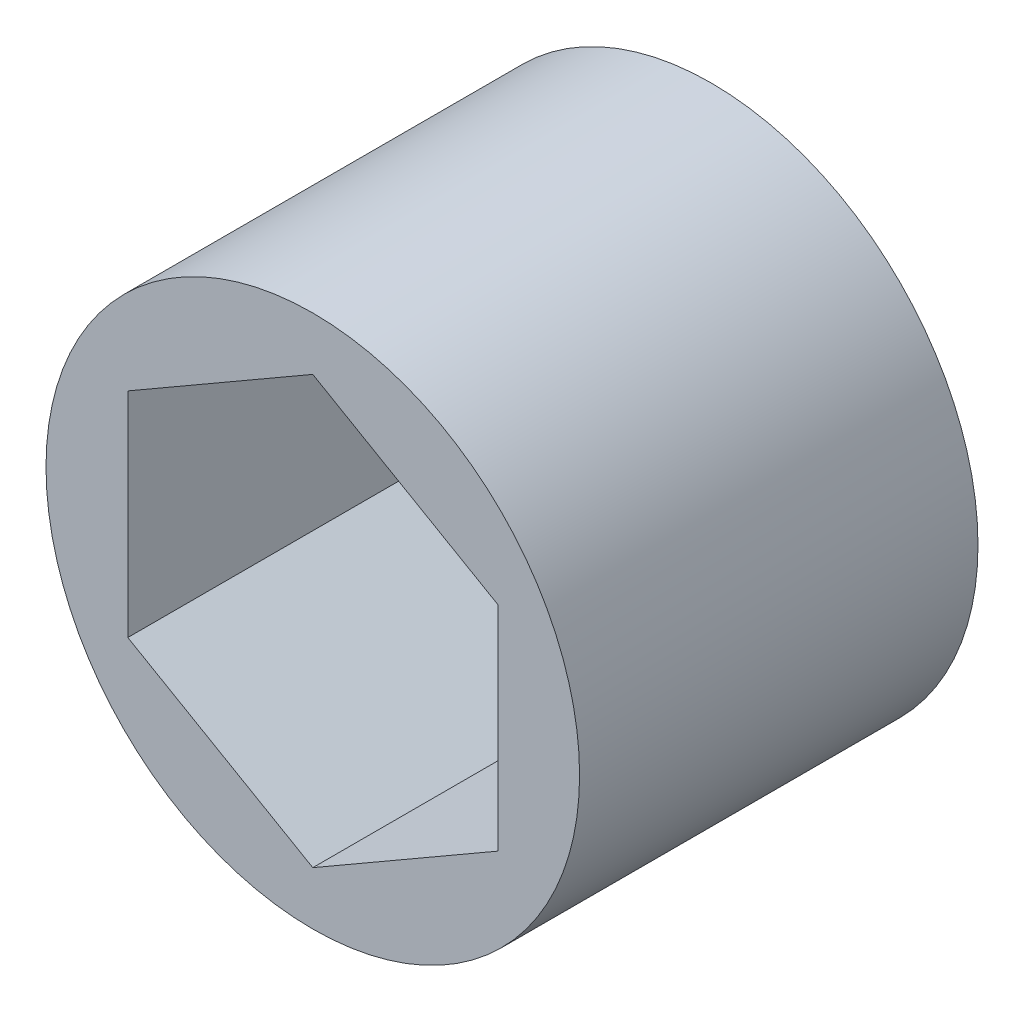
ISO-10303-21;
HEADER;
FILE_DESCRIPTION(('STEP AP214'),'2;1');
FILE_NAME('part.step','',(''),(''),'','','');
FILE_SCHEMA(('AUTOMOTIVE_DESIGN { 1 0 10303 214 1 1 1 1 }'));
ENDSEC;
DATA;
#1=APPLICATION_CONTEXT('core data for automotive mechanical design processes');
#2=APPLICATION_PROTOCOL_DEFINITION('international standard','automotive_design',2000,#1);
#3=PRODUCT_CONTEXT('',#1,'mechanical');
#4=PRODUCT('Part','Part','',(#3));
#5=PRODUCT_RELATED_PRODUCT_CATEGORY('part','',(#4));
#6=PRODUCT_DEFINITION_FORMATION('','',#4);
#7=PRODUCT_DEFINITION_CONTEXT('part definition',#1,'design');
#8=PRODUCT_DEFINITION('design','',#6,#7);
#9=PRODUCT_DEFINITION_SHAPE('','',#8);
#10=(LENGTH_UNIT() NAMED_UNIT(*) SI_UNIT(.MILLI.,.METRE.));
#11=(NAMED_UNIT(*) PLANE_ANGLE_UNIT() SI_UNIT($,.RADIAN.));
#12=(NAMED_UNIT(*) SI_UNIT($,.STERADIAN.) SOLID_ANGLE_UNIT());
#13=UNCERTAINTY_MEASURE_WITH_UNIT(LENGTH_MEASURE(1.E-05),#10,'distance_accuracy_value','');
#14=(GEOMETRIC_REPRESENTATION_CONTEXT(3) GLOBAL_UNCERTAINTY_ASSIGNED_CONTEXT((#13)) GLOBAL_UNIT_ASSIGNED_CONTEXT((#10,
#11,#12)) REPRESENTATION_CONTEXT('',''));
#15=CARTESIAN_POINT('',(0.,0.,0.));
#16=DIRECTION('',(0.,0.,1.));
#17=DIRECTION('',(1.,0.,0.));
#18=AXIS2_PLACEMENT_3D('',#15,#16,#17);
#19=CARTESIAN_POINT('',(0.,0.,7.112));
#20=DIRECTION('',(0.,0.,1.));
#21=DIRECTION('',(1.,0.,0.));
#22=AXIS2_PLACEMENT_3D('',#19,#20,#21);
#23=PLANE('',#22);
#24=CARTESIAN_POINT('',(0.,0.,7.112));
#25=DIRECTION('',(0.,0.,1.));
#26=DIRECTION('',(1.,0.,0.));
#27=AXIS2_PLACEMENT_3D('',#24,#25,#26);
#28=CIRCLE('',#27,9.525);
#29=CARTESIAN_POINT('',(9.525,0.,7.112));
#30=VERTEX_POINT('',#29);
#31=EDGE_CURVE('E11',#30,#30,#28,.T.);
#32=ORIENTED_EDGE('',*,*,#31,.T.);
#33=EDGE_LOOP('',(#32));
#34=FACE_BOUND('',#33,.T.);
#35=DIRECTION('',(-0.866025403784439,-0.5,0.));
#36=VECTOR('',#35,1.);
#37=CARTESIAN_POINT('',(0.,7.62564235545658,7.112));
#38=LINE('',#37,#36);
#39=CARTESIAN_POINT('',(0.,7.62564235545658,7.112));
#40=VERTEX_POINT('',#39);
#41=CARTESIAN_POINT('',(-6.604,3.81282117772829,7.112));
#42=VERTEX_POINT('',#41);
#43=EDGE_CURVE('E108',#40,#42,#38,.T.);
#44=ORIENTED_EDGE('',*,*,#43,.F.);
#45=DIRECTION('',(-0.866025403784439,0.5,0.));
#46=VECTOR('',#45,1.);
#47=CARTESIAN_POINT('',(6.604,3.81282117772829,7.112));
#48=LINE('',#47,#46);
#49=CARTESIAN_POINT('',(6.604,3.81282117772829,7.112));
#50=VERTEX_POINT('',#49);
#51=EDGE_CURVE('E99',#50,#40,#48,.T.);
#52=ORIENTED_EDGE('',*,*,#51,.F.);
#53=DIRECTION('',(0.,1.,0.));
#54=VECTOR('',#53,1.);
#55=CARTESIAN_POINT('',(6.604,-3.81282117772829,7.112));
#56=LINE('',#55,#54);
#57=CARTESIAN_POINT('',(6.604,-3.81282117772829,7.112));
#58=VERTEX_POINT('',#57);
#59=EDGE_CURVE('E133',#58,#50,#56,.T.);
#60=ORIENTED_EDGE('',*,*,#59,.F.);
#61=DIRECTION('',(0.866025403784439,0.5,0.));
#62=VECTOR('',#61,1.);
#63=CARTESIAN_POINT('',(0.,-7.62564235545658,7.112));
#64=LINE('',#63,#62);
#65=CARTESIAN_POINT('',(0.,-7.62564235545658,7.112));
#66=VERTEX_POINT('',#65);
#67=EDGE_CURVE('E130',#66,#58,#64,.T.);
#68=ORIENTED_EDGE('',*,*,#67,.F.);
#69=DIRECTION('',(0.866025403784439,-0.5,0.));
#70=VECTOR('',#69,1.);
#71=CARTESIAN_POINT('',(-6.604,-3.81282117772829,7.112));
#72=LINE('',#71,#70);
#73=CARTESIAN_POINT('',(-6.604,-3.81282117772829,7.112));
#74=VERTEX_POINT('',#73);
#75=EDGE_CURVE('E125',#74,#66,#72,.T.);
#76=ORIENTED_EDGE('',*,*,#75,.F.);
#77=DIRECTION('',(0.,-1.,0.));
#78=VECTOR('',#77,1.);
#79=CARTESIAN_POINT('',(-6.604,3.81282117772829,7.112));
#80=LINE('',#79,#78);
#81=EDGE_CURVE('E121',#42,#74,#80,.T.);
#82=ORIENTED_EDGE('',*,*,#81,.F.);
#83=EDGE_LOOP('',(#44,#52,#60,#68,#76,#82));
#84=FACE_BOUND('',#83,.T.);
#85=ADVANCED_FACE('F45',(#34,#84),#23,.T.);
#86=CARTESIAN_POINT('',(0.,0.,-7.112));
#87=DIRECTION('',(0.,0.,1.));
#88=DIRECTION('',(1.,0.,0.));
#89=AXIS2_PLACEMENT_3D('',#86,#87,#88);
#90=PLANE('',#89);
#91=CARTESIAN_POINT('',(0.,0.,-7.112));
#92=DIRECTION('',(0.,0.,1.));
#93=DIRECTION('',(1.,0.,0.));
#94=AXIS2_PLACEMENT_3D('',#91,#92,#93);
#95=CIRCLE('',#94,9.525);
#96=CARTESIAN_POINT('',(9.525,0.,-7.112));
#97=VERTEX_POINT('',#96);
#98=EDGE_CURVE('E49',#97,#97,#95,.T.);
#99=ORIENTED_EDGE('',*,*,#98,.F.);
#100=EDGE_LOOP('',(#99));
#101=FACE_BOUND('',#100,.T.);
#102=DIRECTION('',(-0.866025403784439,0.5,0.));
#103=VECTOR('',#102,1.);
#104=CARTESIAN_POINT('',(6.604,3.81282117772829,-7.112));
#105=LINE('',#104,#103);
#106=CARTESIAN_POINT('',(6.604,3.81282117772829,-7.112));
#107=VERTEX_POINT('',#106);
#108=CARTESIAN_POINT('',(0.,7.62564235545658,-7.112));
#109=VERTEX_POINT('',#108);
#110=EDGE_CURVE('E69',#107,#109,#105,.T.);
#111=ORIENTED_EDGE('',*,*,#110,.T.);
#112=DIRECTION('',(-0.866025403784439,-0.5,0.));
#113=VECTOR('',#112,1.);
#114=CARTESIAN_POINT('',(0.,7.62564235545658,-7.112));
#115=LINE('',#114,#113);
#116=CARTESIAN_POINT('',(-6.604,3.81282117772829,-7.112));
#117=VERTEX_POINT('',#116);
#118=EDGE_CURVE('E115',#109,#117,#115,.T.);
#119=ORIENTED_EDGE('',*,*,#118,.T.);
#120=DIRECTION('',(0.,-1.,0.));
#121=VECTOR('',#120,1.);
#122=CARTESIAN_POINT('',(-6.604,3.81282117772829,-7.112));
#123=LINE('',#122,#121);
#124=CARTESIAN_POINT('',(-6.604,-3.81282117772829,-7.112));
#125=VERTEX_POINT('',#124);
#126=EDGE_CURVE('E140',#117,#125,#123,.T.);
#127=ORIENTED_EDGE('',*,*,#126,.T.);
#128=DIRECTION('',(0.866025403784439,-0.5,0.));
#129=VECTOR('',#128,1.);
#130=CARTESIAN_POINT('',(-6.604,-3.81282117772829,-7.112));
#131=LINE('',#130,#129);
#132=CARTESIAN_POINT('',(0.,-7.62564235545658,-7.112));
#133=VERTEX_POINT('',#132);
#134=EDGE_CURVE('E144',#125,#133,#131,.T.);
#135=ORIENTED_EDGE('',*,*,#134,.T.);
#136=DIRECTION('',(0.866025403784439,0.5,0.));
#137=VECTOR('',#136,1.);
#138=CARTESIAN_POINT('',(0.,-7.62564235545658,-7.112));
#139=LINE('',#138,#137);
#140=CARTESIAN_POINT('',(6.604,-3.81282117772829,-7.112));
#141=VERTEX_POINT('',#140);
#142=EDGE_CURVE('E148',#133,#141,#139,.T.);
#143=ORIENTED_EDGE('',*,*,#142,.T.);
#144=DIRECTION('',(0.,1.,0.));
#145=VECTOR('',#144,1.);
#146=CARTESIAN_POINT('',(6.604,-3.81282117772829,-7.112));
#147=LINE('',#146,#145);
#148=EDGE_CURVE('E109',#141,#107,#147,.T.);
#149=ORIENTED_EDGE('',*,*,#148,.T.);
#150=EDGE_LOOP('',(#111,#119,#127,#135,#143,#149));
#151=FACE_BOUND('',#150,.T.);
#152=ADVANCED_FACE('F172',(#101,#151),#90,.F.);
#153=CARTESIAN_POINT('',(0.,0.,7.112));
#154=DIRECTION('',(0.,0.,-1.));
#155=DIRECTION('',(-1.,0.,0.));
#156=AXIS2_PLACEMENT_3D('',#153,#154,#155);
#157=CYLINDRICAL_SURFACE('',#156,9.525);
#158=ORIENTED_EDGE('',*,*,#31,.F.);
#159=EDGE_LOOP('',(#158));
#160=FACE_BOUND('',#159,.T.);
#161=ORIENTED_EDGE('',*,*,#98,.T.);
#162=EDGE_LOOP('',(#161));
#163=FACE_BOUND('',#162,.T.);
#164=ADVANCED_FACE('F47',(#160,#163),#157,.T.);
#165=CARTESIAN_POINT('',(6.604,3.81282117772829,7.112));
#166=DIRECTION('',(-0.5,-0.866025403784439,0.));
#167=DIRECTION('',(0.866025403784439,-0.5,0.));
#168=AXIS2_PLACEMENT_3D('',#165,#166,#167);
#169=PLANE('',#168);
#170=ORIENTED_EDGE('',*,*,#110,.F.);
#171=DIRECTION('',(0.,0.,-1.));
#172=VECTOR('',#171,1.);
#173=CARTESIAN_POINT('',(6.604,3.81282117772829,7.112));
#174=LINE('',#173,#172);
#175=EDGE_CURVE('E103',#50,#107,#174,.T.);
#176=ORIENTED_EDGE('',*,*,#175,.F.);
#177=ORIENTED_EDGE('',*,*,#51,.T.);
#178=DIRECTION('',(0.,0.,-1.));
#179=VECTOR('',#178,1.);
#180=CARTESIAN_POINT('',(0.,7.62564235545658,7.112));
#181=LINE('',#180,#179);
#182=EDGE_CURVE('E102',#40,#109,#181,.T.);
#183=ORIENTED_EDGE('',*,*,#182,.T.);
#184=EDGE_LOOP('',(#170,#176,#177,#183));
#185=FACE_BOUND('',#184,.T.);
#186=ADVANCED_FACE('F101',(#185),#169,.T.);
#187=CARTESIAN_POINT('',(0.,7.62564235545658,7.112));
#188=DIRECTION('',(0.5,-0.866025403784439,0.));
#189=DIRECTION('',(0.866025403784439,0.5,0.));
#190=AXIS2_PLACEMENT_3D('',#187,#188,#189);
#191=PLANE('',#190);
#192=ORIENTED_EDGE('',*,*,#118,.F.);
#193=ORIENTED_EDGE('',*,*,#182,.F.);
#194=ORIENTED_EDGE('',*,*,#43,.T.);
#195=DIRECTION('',(0.,0.,-1.));
#196=VECTOR('',#195,1.);
#197=CARTESIAN_POINT('',(-6.604,3.81282117772829,7.112));
#198=LINE('',#197,#196);
#199=EDGE_CURVE('E117',#42,#117,#198,.T.);
#200=ORIENTED_EDGE('',*,*,#199,.T.);
#201=EDGE_LOOP('',(#192,#193,#194,#200));
#202=FACE_BOUND('',#201,.T.);
#203=ADVANCED_FACE('F112',(#202),#191,.T.);
#204=CARTESIAN_POINT('',(-6.604,3.81282117772829,7.112));
#205=DIRECTION('',(1.,0.,0.));
#206=DIRECTION('',(0.,1.,0.));
#207=AXIS2_PLACEMENT_3D('',#204,#205,#206);
#208=PLANE('',#207);
#209=ORIENTED_EDGE('',*,*,#126,.F.);
#210=ORIENTED_EDGE('',*,*,#199,.F.);
#211=ORIENTED_EDGE('',*,*,#81,.T.);
#212=DIRECTION('',(0.,0.,-1.));
#213=VECTOR('',#212,1.);
#214=CARTESIAN_POINT('',(-6.604,-3.81282117772829,7.112));
#215=LINE('',#214,#213);
#216=EDGE_CURVE('E162',#74,#125,#215,.T.);
#217=ORIENTED_EDGE('',*,*,#216,.T.);
#218=EDGE_LOOP('',(#209,#210,#211,#217));
#219=FACE_BOUND('',#218,.T.);
#220=ADVANCED_FACE('F168',(#219),#208,.T.);
#221=CARTESIAN_POINT('',(-6.604,-3.81282117772829,7.112));
#222=DIRECTION('',(0.5,0.866025403784439,0.));
#223=DIRECTION('',(-0.866025403784439,0.5,0.));
#224=AXIS2_PLACEMENT_3D('',#221,#222,#223);
#225=PLANE('',#224);
#226=ORIENTED_EDGE('',*,*,#134,.F.);
#227=ORIENTED_EDGE('',*,*,#216,.F.);
#228=ORIENTED_EDGE('',*,*,#75,.T.);
#229=DIRECTION('',(0.,0.,-1.));
#230=VECTOR('',#229,1.);
#231=CARTESIAN_POINT('',(0.,-7.62564235545658,7.112));
#232=LINE('',#231,#230);
#233=EDGE_CURVE('E159',#66,#133,#232,.T.);
#234=ORIENTED_EDGE('',*,*,#233,.T.);
#235=EDGE_LOOP('',(#226,#227,#228,#234));
#236=FACE_BOUND('',#235,.T.);
#237=ADVANCED_FACE('F180',(#236),#225,.T.);
#238=CARTESIAN_POINT('',(0.,-7.62564235545658,7.112));
#239=DIRECTION('',(-0.5,0.866025403784439,0.));
#240=DIRECTION('',(-0.866025403784439,-0.5,0.));
#241=AXIS2_PLACEMENT_3D('',#238,#239,#240);
#242=PLANE('',#241);
#243=ORIENTED_EDGE('',*,*,#142,.F.);
#244=ORIENTED_EDGE('',*,*,#233,.F.);
#245=ORIENTED_EDGE('',*,*,#67,.T.);
#246=DIRECTION('',(0.,0.,-1.));
#247=VECTOR('',#246,1.);
#248=CARTESIAN_POINT('',(6.604,-3.81282117772829,7.112));
#249=LINE('',#248,#247);
#250=EDGE_CURVE('E61',#58,#141,#249,.T.);
#251=ORIENTED_EDGE('',*,*,#250,.T.);
#252=EDGE_LOOP('',(#243,#244,#245,#251));
#253=FACE_BOUND('',#252,.T.);
#254=ADVANCED_FACE('F178',(#253),#242,.T.);
#255=CARTESIAN_POINT('',(6.604,-3.81282117772829,7.112));
#256=DIRECTION('',(-1.,0.,0.));
#257=DIRECTION('',(0.,-1.,0.));
#258=AXIS2_PLACEMENT_3D('',#255,#256,#257);
#259=PLANE('',#258);
#260=ORIENTED_EDGE('',*,*,#148,.F.);
#261=ORIENTED_EDGE('',*,*,#250,.F.);
#262=ORIENTED_EDGE('',*,*,#59,.T.);
#263=ORIENTED_EDGE('',*,*,#175,.T.);
#264=EDGE_LOOP('',(#260,#261,#262,#263));
#265=FACE_BOUND('',#264,.T.);
#266=ADVANCED_FACE('F174',(#265),#259,.T.);
#267=CLOSED_SHELL('',(#85,#152,#164,#186,#203,#220,#237,#254,#266));
#268=MANIFOLD_SOLID_BREP('B2',#267);
#269=ADVANCED_BREP_SHAPE_REPRESENTATION('',(#18,#268),#14);
#270=SHAPE_DEFINITION_REPRESENTATION(#9,#269);
ENDSEC;
END-ISO-10303-21;
